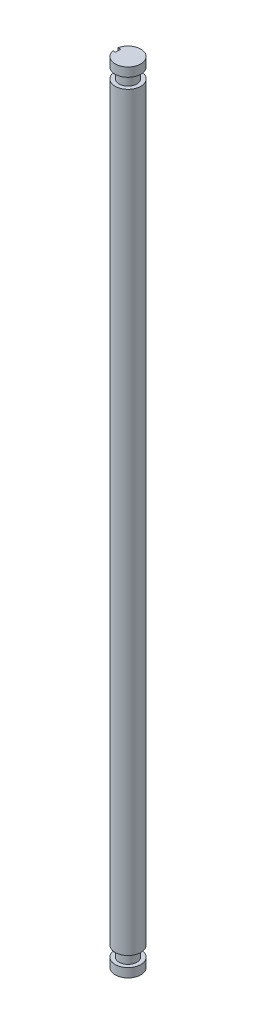
ISO-10303-21;
HEADER;
FILE_DESCRIPTION(('STEP AP214'),'2;1');
FILE_NAME('part.step','',(''),(''),'','','');
FILE_SCHEMA(('AUTOMOTIVE_DESIGN { 1 0 10303 214 1 1 1 1 }'));
ENDSEC;
DATA;
#1=APPLICATION_CONTEXT('core data for automotive mechanical design processes');
#2=APPLICATION_PROTOCOL_DEFINITION('international standard','automotive_design',2000,#1);
#3=PRODUCT_CONTEXT('',#1,'mechanical');
#4=PRODUCT('Part','Part','',(#3));
#5=PRODUCT_RELATED_PRODUCT_CATEGORY('part','',(#4));
#6=PRODUCT_DEFINITION_FORMATION('','',#4);
#7=PRODUCT_DEFINITION_CONTEXT('part definition',#1,'design');
#8=PRODUCT_DEFINITION('design','',#6,#7);
#9=PRODUCT_DEFINITION_SHAPE('','',#8);
#10=(LENGTH_UNIT() NAMED_UNIT(*) SI_UNIT(.MILLI.,.METRE.));
#11=(NAMED_UNIT(*) PLANE_ANGLE_UNIT() SI_UNIT($,.RADIAN.));
#12=(NAMED_UNIT(*) SI_UNIT($,.STERADIAN.) SOLID_ANGLE_UNIT());
#13=UNCERTAINTY_MEASURE_WITH_UNIT(LENGTH_MEASURE(1.E-05),#10,'distance_accuracy_value','');
#14=(GEOMETRIC_REPRESENTATION_CONTEXT(3) GLOBAL_UNCERTAINTY_ASSIGNED_CONTEXT((#13)) GLOBAL_UNIT_ASSIGNED_CONTEXT((#10,
#11,#12)) REPRESENTATION_CONTEXT('',''));
#15=CARTESIAN_POINT('',(0.,0.,0.));
#16=DIRECTION('',(0.,0.,1.));
#17=DIRECTION('',(1.,0.,0.));
#18=AXIS2_PLACEMENT_3D('',#15,#16,#17);
#19=CARTESIAN_POINT('',(0.,-976.376,0.));
#20=DIRECTION('',(0.,1.,0.));
#21=DIRECTION('',(0.,0.,1.));
#22=AXIS2_PLACEMENT_3D('',#19,#20,#21);
#23=PLANE('',#22);
#24=DIRECTION('',(1.,0.,0.));
#25=VECTOR('',#24,1.);
#26=CARTESIAN_POINT('',(0.,-976.376,-6.35));
#27=LINE('',#26,#25);
#28=CARTESIAN_POINT('',(-31.0890766653257,-976.376,-6.35));
#29=VERTEX_POINT('',#28);
#30=CARTESIAN_POINT('',(-24.60625,-976.376,-6.35));
#31=VERTEX_POINT('',#30);
#32=EDGE_CURVE('E193',#29,#31,#27,.T.);
#33=ORIENTED_EDGE('',*,*,#32,.F.);
#34=CARTESIAN_POINT('',(0.,-976.376,0.));
#35=DIRECTION('',(0.,-1.,0.));
#36=DIRECTION('',(0.,0.,-1.));
#37=AXIS2_PLACEMENT_3D('',#34,#35,#36);
#38=CIRCLE('',#37,31.73095);
#39=CARTESIAN_POINT('',(-31.0890766653257,-976.376,6.35));
#40=VERTEX_POINT('',#39);
#41=EDGE_CURVE('E141',#29,#40,#38,.T.);
#42=ORIENTED_EDGE('',*,*,#41,.T.);
#43=DIRECTION('',(-1.,0.,0.));
#44=VECTOR('',#43,1.);
#45=CARTESIAN_POINT('',(0.,-976.376,6.35));
#46=LINE('',#45,#44);
#47=CARTESIAN_POINT('',(-24.60625,-976.376,6.35));
#48=VERTEX_POINT('',#47);
#49=EDGE_CURVE('E209',#48,#40,#46,.T.);
#50=ORIENTED_EDGE('',*,*,#49,.F.);
#51=DIRECTION('',(0.,0.,1.));
#52=VECTOR('',#51,1.);
#53=CARTESIAN_POINT('',(-24.60625,-976.376,0.));
#54=LINE('',#53,#52);
#55=EDGE_CURVE('E184',#31,#48,#54,.T.);
#56=ORIENTED_EDGE('',*,*,#55,.F.);
#57=EDGE_LOOP('',(#33,#42,#50,#56));
#58=FACE_BOUND('',#57,.T.);
#59=ADVANCED_FACE('F43',(#58),#23,.F.);
#60=CARTESIAN_POINT('',(0.,-1001.776,0.));
#61=DIRECTION('',(0.,-1.,0.));
#62=DIRECTION('',(0.,0.,-1.));
#63=AXIS2_PLACEMENT_3D('',#60,#61,#62);
#64=CYLINDRICAL_SURFACE('',#63,31.73095);
#65=DIRECTION('',(0.,-1.,0.));
#66=VECTOR('',#65,1.);
#67=CARTESIAN_POINT('',(-31.0890766653257,-1001.776,-6.35));
#68=LINE('',#67,#66);
#69=CARTESIAN_POINT('',(-31.0890766653257,-954.024,-6.35));
#70=VERTEX_POINT('',#69);
#71=EDGE_CURVE('E195',#70,#29,#68,.T.);
#72=ORIENTED_EDGE('',*,*,#71,.F.);
#73=CARTESIAN_POINT('',(0.,-954.024,0.));
#74=DIRECTION('',(0.,-1.,0.));
#75=DIRECTION('',(0.,0.,-1.));
#76=AXIS2_PLACEMENT_3D('',#73,#74,#75);
#77=CIRCLE('',#76,31.73095);
#78=CARTESIAN_POINT('',(-31.0890766653257,-954.024,6.35));
#79=VERTEX_POINT('',#78);
#80=EDGE_CURVE('E158',#70,#79,#77,.T.);
#81=ORIENTED_EDGE('',*,*,#80,.T.);
#82=DIRECTION('',(0.,-1.,0.));
#83=VECTOR('',#82,1.);
#84=CARTESIAN_POINT('',(-31.0890766653257,-1001.776,6.35));
#85=LINE('',#84,#83);
#86=EDGE_CURVE('E57',#40,#79,#85,.F.);
#87=ORIENTED_EDGE('',*,*,#86,.F.);
#88=ORIENTED_EDGE('',*,*,#41,.F.);
#89=EDGE_LOOP('',(#72,#81,#87,#88));
#90=FACE_BOUND('',#89,.T.);
#91=ADVANCED_FACE('F276',(#90),#64,.T.);
#92=CARTESIAN_POINT('',(-31.73095,-954.024,0.));
#93=DIRECTION('',(0.,-1.,0.));
#94=DIRECTION('',(0.,0.,-1.));
#95=AXIS2_PLACEMENT_3D('',#92,#93,#94);
#96=PLANE('',#95);
#97=CARTESIAN_POINT('',(0.,-954.024,0.));
#98=DIRECTION('',(0.,-1.,0.));
#99=DIRECTION('',(0.,0.,-1.));
#100=AXIS2_PLACEMENT_3D('',#97,#98,#99);
#101=CIRCLE('',#100,22.0218);
#102=CARTESIAN_POINT('',(0.,-954.024,-22.0218));
#103=VERTEX_POINT('',#102);
#104=EDGE_CURVE('E161',#103,#103,#101,.T.);
#105=ORIENTED_EDGE('',*,*,#104,.T.);
#106=EDGE_LOOP('',(#105));
#107=FACE_BOUND('',#106,.T.);
#108=DIRECTION('',(-1.,0.,0.));
#109=VECTOR('',#108,1.);
#110=CARTESIAN_POINT('',(-31.73095,-954.024,-6.35));
#111=LINE('',#110,#109);
#112=CARTESIAN_POINT('',(-24.60625,-954.024,-6.35));
#113=VERTEX_POINT('',#112);
#114=EDGE_CURVE('E197',#113,#70,#111,.T.);
#115=ORIENTED_EDGE('',*,*,#114,.F.);
#116=DIRECTION('',(0.,0.,-1.));
#117=VECTOR('',#116,1.);
#118=CARTESIAN_POINT('',(-24.60625,-954.024,0.));
#119=LINE('',#118,#117);
#120=CARTESIAN_POINT('',(-24.60625,-954.024,6.35));
#121=VERTEX_POINT('',#120);
#122=EDGE_CURVE('E186',#121,#113,#119,.T.);
#123=ORIENTED_EDGE('',*,*,#122,.F.);
#124=DIRECTION('',(1.,0.,0.));
#125=VECTOR('',#124,1.);
#126=CARTESIAN_POINT('',(-31.73095,-954.024,6.35));
#127=LINE('',#126,#125);
#128=EDGE_CURVE('E212',#79,#121,#127,.T.);
#129=ORIENTED_EDGE('',*,*,#128,.F.);
#130=ORIENTED_EDGE('',*,*,#80,.F.);
#131=EDGE_LOOP('',(#115,#123,#129,#130));
#132=FACE_BOUND('',#131,.T.);
#133=ADVANCED_FACE('F282',(#107,#132),#96,.F.);
#134=CARTESIAN_POINT('',(-22.0218,-928.2176,0.));
#135=DIRECTION('',(0.,1.,0.));
#136=DIRECTION('',(0.,0.,1.));
#137=AXIS2_PLACEMENT_3D('',#134,#135,#136);
#138=PLANE('',#137);
#139=CARTESIAN_POINT('',(0.,-928.2176,0.));
#140=DIRECTION('',(0.,-1.,0.));
#141=DIRECTION('',(0.,0.,-1.));
#142=AXIS2_PLACEMENT_3D('',#139,#140,#141);
#143=CIRCLE('',#142,22.0218);
#144=CARTESIAN_POINT('',(0.,-928.2176,-22.0218));
#145=VERTEX_POINT('',#144);
#146=EDGE_CURVE('E164',#145,#145,#143,.T.);
#147=ORIENTED_EDGE('',*,*,#146,.F.);
#148=EDGE_LOOP('',(#147));
#149=FACE_BOUND('',#148,.T.);
#150=DIRECTION('',(1.,0.,0.));
#151=VECTOR('',#150,1.);
#152=CARTESIAN_POINT('',(-22.0218,-928.2176,-6.35));
#153=LINE('',#152,#151);
#154=CARTESIAN_POINT('',(-31.0890766653257,-928.2176,-6.35));
#155=VERTEX_POINT('',#154);
#156=CARTESIAN_POINT('',(-24.60625,-928.2176,-6.35));
#157=VERTEX_POINT('',#156);
#158=EDGE_CURVE('E199',#155,#157,#153,.T.);
#159=ORIENTED_EDGE('',*,*,#158,.F.);
#160=CARTESIAN_POINT('',(0.,-928.2176,0.));
#161=DIRECTION('',(0.,-1.,0.));
#162=DIRECTION('',(0.,0.,-1.));
#163=AXIS2_PLACEMENT_3D('',#160,#161,#162);
#164=CIRCLE('',#163,31.73095);
#165=CARTESIAN_POINT('',(-31.0890766653257,-928.2176,6.35));
#166=VERTEX_POINT('',#165);
#167=EDGE_CURVE('E167',#155,#166,#164,.T.);
#168=ORIENTED_EDGE('',*,*,#167,.T.);
#169=DIRECTION('',(-1.,0.,0.));
#170=VECTOR('',#169,1.);
#171=CARTESIAN_POINT('',(-22.0218,-928.2176,6.35));
#172=LINE('',#171,#170);
#173=CARTESIAN_POINT('',(-24.60625,-928.2176,6.35));
#174=VERTEX_POINT('',#173);
#175=EDGE_CURVE('E214',#174,#166,#172,.T.);
#176=ORIENTED_EDGE('',*,*,#175,.F.);
#177=DIRECTION('',(0.,0.,1.));
#178=VECTOR('',#177,1.);
#179=CARTESIAN_POINT('',(-24.60625,-928.2176,0.));
#180=LINE('',#179,#178);
#181=EDGE_CURVE('E188',#157,#174,#180,.T.);
#182=ORIENTED_EDGE('',*,*,#181,.F.);
#183=EDGE_LOOP('',(#159,#168,#176,#182));
#184=FACE_BOUND('',#183,.T.);
#185=ADVANCED_FACE('F237',(#149,#184),#138,.F.);
#186=CARTESIAN_POINT('',(0.,-1001.776,0.));
#187=DIRECTION('',(0.,-1.,0.));
#188=DIRECTION('',(0.,0.,-1.));
#189=AXIS2_PLACEMENT_3D('',#186,#187,#188);
#190=CYLINDRICAL_SURFACE('',#189,31.73095);
#191=DIRECTION('',(0.,-1.,0.));
#192=VECTOR('',#191,1.);
#193=CARTESIAN_POINT('',(-31.0890766653257,-1001.776,-6.35));
#194=LINE('',#193,#192);
#195=CARTESIAN_POINT('',(-31.0890766653257,928.3446,-6.35));
#196=VERTEX_POINT('',#195);
#197=EDGE_CURVE('E201',#196,#155,#194,.T.);
#198=ORIENTED_EDGE('',*,*,#197,.F.);
#199=CARTESIAN_POINT('',(0.,928.3446,0.));
#200=DIRECTION('',(0.,-1.,0.));
#201=DIRECTION('',(0.,0.,-1.));
#202=AXIS2_PLACEMENT_3D('',#199,#200,#201);
#203=CIRCLE('',#202,31.73095);
#204=CARTESIAN_POINT('',(-31.0890766653257,928.3446,6.35));
#205=VERTEX_POINT('',#204);
#206=EDGE_CURVE('E170',#196,#205,#203,.T.);
#207=ORIENTED_EDGE('',*,*,#206,.T.);
#208=DIRECTION('',(0.,-1.,0.));
#209=VECTOR('',#208,1.);
#210=CARTESIAN_POINT('',(-31.0890766653257,-1001.776,6.35));
#211=LINE('',#210,#209);
#212=EDGE_CURVE('E65',#166,#205,#211,.F.);
#213=ORIENTED_EDGE('',*,*,#212,.F.);
#214=ORIENTED_EDGE('',*,*,#167,.F.);
#215=EDGE_LOOP('',(#198,#207,#213,#214));
#216=FACE_BOUND('',#215,.T.);
#217=ADVANCED_FACE('F241',(#216),#190,.T.);
#218=CARTESIAN_POINT('',(-31.73095,928.3446,0.));
#219=DIRECTION('',(0.,-1.,0.));
#220=DIRECTION('',(0.,0.,-1.));
#221=AXIS2_PLACEMENT_3D('',#218,#219,#220);
#222=PLANE('',#221);
#223=CARTESIAN_POINT('',(0.,928.3446,0.));
#224=DIRECTION('',(0.,-1.,0.));
#225=DIRECTION('',(0.,0.,-1.));
#226=AXIS2_PLACEMENT_3D('',#223,#224,#225);
#227=CIRCLE('',#226,22.0218);
#228=CARTESIAN_POINT('',(0.,928.3446,-22.0218));
#229=VERTEX_POINT('',#228);
#230=EDGE_CURVE('E173',#229,#229,#227,.T.);
#231=ORIENTED_EDGE('',*,*,#230,.T.);
#232=EDGE_LOOP('',(#231));
#233=FACE_BOUND('',#232,.T.);
#234=DIRECTION('',(-1.,0.,0.));
#235=VECTOR('',#234,1.);
#236=CARTESIAN_POINT('',(-31.73095,928.3446,-6.35));
#237=LINE('',#236,#235);
#238=CARTESIAN_POINT('',(-24.60625,928.3446,-6.35));
#239=VERTEX_POINT('',#238);
#240=EDGE_CURVE('E203',#239,#196,#237,.T.);
#241=ORIENTED_EDGE('',*,*,#240,.F.);
#242=DIRECTION('',(0.,0.,-1.));
#243=VECTOR('',#242,1.);
#244=CARTESIAN_POINT('',(-24.60625,928.3446,0.));
#245=LINE('',#244,#243);
#246=CARTESIAN_POINT('',(-24.60625,928.3446,6.35));
#247=VERTEX_POINT('',#246);
#248=EDGE_CURVE('E190',#247,#239,#245,.T.);
#249=ORIENTED_EDGE('',*,*,#248,.F.);
#250=DIRECTION('',(1.,0.,0.));
#251=VECTOR('',#250,1.);
#252=CARTESIAN_POINT('',(-31.73095,928.3446,6.35));
#253=LINE('',#252,#251);
#254=EDGE_CURVE('E217',#205,#247,#253,.T.);
#255=ORIENTED_EDGE('',*,*,#254,.F.);
#256=ORIENTED_EDGE('',*,*,#206,.F.);
#257=EDGE_LOOP('',(#241,#249,#255,#256));
#258=FACE_BOUND('',#257,.T.);
#259=ADVANCED_FACE('F245',(#233,#258),#222,.F.);
#260=CARTESIAN_POINT('',(-22.0218,954.151,0.));
#261=DIRECTION('',(0.,1.,0.));
#262=DIRECTION('',(0.,0.,1.));
#263=AXIS2_PLACEMENT_3D('',#260,#261,#262);
#264=PLANE('',#263);
#265=CARTESIAN_POINT('',(0.,954.151,0.));
#266=DIRECTION('',(0.,-1.,0.));
#267=DIRECTION('',(0.,0.,-1.));
#268=AXIS2_PLACEMENT_3D('',#265,#266,#267);
#269=CIRCLE('',#268,22.0218);
#270=CARTESIAN_POINT('',(0.,954.151,-22.0218));
#271=VERTEX_POINT('',#270);
#272=EDGE_CURVE('E176',#271,#271,#269,.T.);
#273=ORIENTED_EDGE('',*,*,#272,.F.);
#274=EDGE_LOOP('',(#273));
#275=FACE_BOUND('',#274,.T.);
#276=DIRECTION('',(1.,0.,0.));
#277=VECTOR('',#276,1.);
#278=CARTESIAN_POINT('',(-22.0218,954.151,-6.35));
#279=LINE('',#278,#277);
#280=CARTESIAN_POINT('',(-31.0890766653257,954.151,-6.35));
#281=VERTEX_POINT('',#280);
#282=CARTESIAN_POINT('',(-24.60625,954.151,-6.35));
#283=VERTEX_POINT('',#282);
#284=EDGE_CURVE('E205',#281,#283,#279,.T.);
#285=ORIENTED_EDGE('',*,*,#284,.F.);
#286=CARTESIAN_POINT('',(0.,954.151,0.));
#287=DIRECTION('',(0.,-1.,0.));
#288=DIRECTION('',(0.,0.,-1.));
#289=AXIS2_PLACEMENT_3D('',#286,#287,#288);
#290=CIRCLE('',#289,31.73095);
#291=CARTESIAN_POINT('',(-31.0890766653257,954.151,6.35));
#292=VERTEX_POINT('',#291);
#293=EDGE_CURVE('E179',#281,#292,#290,.T.);
#294=ORIENTED_EDGE('',*,*,#293,.T.);
#295=DIRECTION('',(-1.,0.,0.));
#296=VECTOR('',#295,1.);
#297=CARTESIAN_POINT('',(-22.0218,954.151,6.35));
#298=LINE('',#297,#296);
#299=CARTESIAN_POINT('',(-24.60625,954.151,6.35));
#300=VERTEX_POINT('',#299);
#301=EDGE_CURVE('E219',#300,#292,#298,.T.);
#302=ORIENTED_EDGE('',*,*,#301,.F.);
#303=DIRECTION('',(0.,0.,1.));
#304=VECTOR('',#303,1.);
#305=CARTESIAN_POINT('',(-24.60625,954.151,0.));
#306=LINE('',#305,#304);
#307=EDGE_CURVE('E148',#283,#300,#306,.T.);
#308=ORIENTED_EDGE('',*,*,#307,.F.);
#309=EDGE_LOOP('',(#285,#294,#302,#308));
#310=FACE_BOUND('',#309,.T.);
#311=ADVANCED_FACE('F254',(#275,#310),#264,.F.);
#312=CARTESIAN_POINT('',(0.,-1001.776,0.));
#313=DIRECTION('',(0.,-1.,0.));
#314=DIRECTION('',(0.,0.,-1.));
#315=AXIS2_PLACEMENT_3D('',#312,#313,#314);
#316=CYLINDRICAL_SURFACE('',#315,31.73095);
#317=DIRECTION('',(0.,-1.,0.));
#318=VECTOR('',#317,1.);
#319=CARTESIAN_POINT('',(-31.0890766653257,-1001.776,-6.35));
#320=LINE('',#319,#318);
#321=CARTESIAN_POINT('',(-31.0890766653257,976.376,-6.35));
#322=VERTEX_POINT('',#321);
#323=EDGE_CURVE('E207',#322,#281,#320,.T.);
#324=ORIENTED_EDGE('',*,*,#323,.F.);
#325=CARTESIAN_POINT('',(0.,976.376,0.));
#326=DIRECTION('',(0.,-1.,0.));
#327=DIRECTION('',(0.,0.,-1.));
#328=AXIS2_PLACEMENT_3D('',#325,#326,#327);
#329=CIRCLE('',#328,31.73095);
#330=CARTESIAN_POINT('',(-31.0890766653257,976.376,6.35));
#331=VERTEX_POINT('',#330);
#332=EDGE_CURVE('E182',#322,#331,#329,.T.);
#333=ORIENTED_EDGE('',*,*,#332,.T.);
#334=DIRECTION('',(0.,-1.,0.));
#335=VECTOR('',#334,1.);
#336=CARTESIAN_POINT('',(-31.0890766653257,-1001.776,6.35));
#337=LINE('',#336,#335);
#338=EDGE_CURVE('E136',#292,#331,#337,.F.);
#339=ORIENTED_EDGE('',*,*,#338,.F.);
#340=ORIENTED_EDGE('',*,*,#293,.F.);
#341=EDGE_LOOP('',(#324,#333,#339,#340));
#342=FACE_BOUND('',#341,.T.);
#343=ADVANCED_FACE('F258',(#342),#316,.T.);
#344=CARTESIAN_POINT('',(-31.73095,976.376,0.));
#345=DIRECTION('',(0.,-1.,0.));
#346=DIRECTION('',(0.,0.,-1.));
#347=AXIS2_PLACEMENT_3D('',#344,#345,#346);
#348=PLANE('',#347);
#349=DIRECTION('',(-1.,0.,0.));
#350=VECTOR('',#349,1.);
#351=CARTESIAN_POINT('',(-31.73095,976.376,-6.35));
#352=LINE('',#351,#350);
#353=CARTESIAN_POINT('',(-24.60625,976.376,-6.35));
#354=VERTEX_POINT('',#353);
#355=EDGE_CURVE('E11',#354,#322,#352,.T.);
#356=ORIENTED_EDGE('',*,*,#355,.F.);
#357=DIRECTION('',(0.,0.,-1.));
#358=VECTOR('',#357,1.);
#359=CARTESIAN_POINT('',(-24.60625,976.376,0.));
#360=LINE('',#359,#358);
#361=CARTESIAN_POINT('',(-24.60625,976.376,6.35));
#362=VERTEX_POINT('',#361);
#363=EDGE_CURVE('E50',#362,#354,#360,.T.);
#364=ORIENTED_EDGE('',*,*,#363,.F.);
#365=DIRECTION('',(1.,0.,0.));
#366=VECTOR('',#365,1.);
#367=CARTESIAN_POINT('',(-31.73095,976.376,6.35));
#368=LINE('',#367,#366);
#369=EDGE_CURVE('E130',#331,#362,#368,.T.);
#370=ORIENTED_EDGE('',*,*,#369,.F.);
#371=ORIENTED_EDGE('',*,*,#332,.F.);
#372=EDGE_LOOP('',(#356,#364,#370,#371));
#373=FACE_BOUND('',#372,.T.);
#374=ADVANCED_FACE('F154',(#373),#348,.F.);
#375=CARTESIAN_POINT('',(0.,-1001.776,0.));
#376=DIRECTION('',(0.,-1.,0.));
#377=DIRECTION('',(0.,0.,-1.));
#378=AXIS2_PLACEMENT_3D('',#375,#376,#377);
#379=CYLINDRICAL_SURFACE('',#378,22.0218);
#380=ORIENTED_EDGE('',*,*,#104,.F.);
#381=EDGE_LOOP('',(#380));
#382=FACE_BOUND('',#381,.T.);
#383=ORIENTED_EDGE('',*,*,#146,.T.);
#384=EDGE_LOOP('',(#383));
#385=FACE_BOUND('',#384,.T.);
#386=ADVANCED_FACE('F301',(#382,#385),#379,.T.);
#387=CARTESIAN_POINT('',(0.,-1001.776,0.));
#388=DIRECTION('',(0.,-1.,0.));
#389=DIRECTION('',(0.,0.,-1.));
#390=AXIS2_PLACEMENT_3D('',#387,#388,#389);
#391=CYLINDRICAL_SURFACE('',#390,22.0218);
#392=ORIENTED_EDGE('',*,*,#230,.F.);
#393=EDGE_LOOP('',(#392));
#394=FACE_BOUND('',#393,.T.);
#395=ORIENTED_EDGE('',*,*,#272,.T.);
#396=EDGE_LOOP('',(#395));
#397=FACE_BOUND('',#396,.T.);
#398=ADVANCED_FACE('F269',(#394,#397),#391,.T.);
#399=CARTESIAN_POINT('',(-24.60625,998.728,6.35));
#400=DIRECTION('',(0.,0.,-1.));
#401=DIRECTION('',(-1.,0.,0.));
#402=AXIS2_PLACEMENT_3D('',#399,#400,#401);
#403=PLANE('',#402);
#404=ORIENTED_EDGE('',*,*,#301,.T.);
#405=ORIENTED_EDGE('',*,*,#338,.T.);
#406=ORIENTED_EDGE('',*,*,#369,.T.);
#407=DIRECTION('',(0.,-1.,0.));
#408=VECTOR('',#407,1.);
#409=CARTESIAN_POINT('',(-24.60625,998.728,6.35));
#410=LINE('',#409,#408);
#411=EDGE_CURVE('E133',#362,#300,#410,.T.);
#412=ORIENTED_EDGE('',*,*,#411,.T.);
#413=EDGE_LOOP('',(#404,#405,#406,#412));
#414=FACE_BOUND('',#413,.T.);
#415=ADVANCED_FACE('F132',(#414),#403,.T.);
#416=CARTESIAN_POINT('',(-24.60625,998.728,-6.35));
#417=DIRECTION('',(0.,0.,1.));
#418=DIRECTION('',(1.,0.,0.));
#419=AXIS2_PLACEMENT_3D('',#416,#417,#418);
#420=PLANE('',#419);
#421=ORIENTED_EDGE('',*,*,#284,.T.);
#422=DIRECTION('',(0.,-1.,0.));
#423=VECTOR('',#422,1.);
#424=CARTESIAN_POINT('',(-24.60625,998.728,-6.35));
#425=LINE('',#424,#423);
#426=EDGE_CURVE('E222',#354,#283,#425,.T.);
#427=ORIENTED_EDGE('',*,*,#426,.F.);
#428=ORIENTED_EDGE('',*,*,#355,.T.);
#429=ORIENTED_EDGE('',*,*,#323,.T.);
#430=EDGE_LOOP('',(#421,#427,#428,#429));
#431=FACE_BOUND('',#430,.T.);
#432=ADVANCED_FACE('F259',(#431),#420,.T.);
#433=CARTESIAN_POINT('',(-24.60625,998.728,-6.35));
#434=DIRECTION('',(-1.,0.,0.));
#435=DIRECTION('',(0.,0.,1.));
#436=AXIS2_PLACEMENT_3D('',#433,#434,#435);
#437=PLANE('',#436);
#438=ORIENTED_EDGE('',*,*,#307,.T.);
#439=ORIENTED_EDGE('',*,*,#411,.F.);
#440=ORIENTED_EDGE('',*,*,#363,.T.);
#441=ORIENTED_EDGE('',*,*,#426,.T.);
#442=EDGE_LOOP('',(#438,#439,#440,#441));
#443=FACE_BOUND('',#442,.T.);
#444=ADVANCED_FACE('F144',(#443),#437,.T.);
#445=ORIENTED_EDGE('',*,*,#175,.T.);
#446=ORIENTED_EDGE('',*,*,#212,.T.);
#447=ORIENTED_EDGE('',*,*,#254,.T.);
#448=EDGE_CURVE('E150',#247,#174,#410,.T.);
#449=ORIENTED_EDGE('',*,*,#448,.T.);
#450=EDGE_LOOP('',(#445,#446,#447,#449));
#451=FACE_BOUND('',#450,.T.);
#452=ADVANCED_FACE('F231',(#451),#403,.T.);
#453=ORIENTED_EDGE('',*,*,#158,.T.);
#454=EDGE_CURVE('E224',#239,#157,#425,.T.);
#455=ORIENTED_EDGE('',*,*,#454,.F.);
#456=ORIENTED_EDGE('',*,*,#240,.T.);
#457=ORIENTED_EDGE('',*,*,#197,.T.);
#458=EDGE_LOOP('',(#453,#455,#456,#457));
#459=FACE_BOUND('',#458,.T.);
#460=ADVANCED_FACE('F250',(#459),#420,.T.);
#461=ORIENTED_EDGE('',*,*,#181,.T.);
#462=ORIENTED_EDGE('',*,*,#448,.F.);
#463=ORIENTED_EDGE('',*,*,#248,.T.);
#464=ORIENTED_EDGE('',*,*,#454,.T.);
#465=EDGE_LOOP('',(#461,#462,#463,#464));
#466=FACE_BOUND('',#465,.T.);
#467=ADVANCED_FACE('F248',(#466),#437,.T.);
#468=ORIENTED_EDGE('',*,*,#55,.T.);
#469=EDGE_CURVE('E152',#121,#48,#410,.T.);
#470=ORIENTED_EDGE('',*,*,#469,.F.);
#471=ORIENTED_EDGE('',*,*,#122,.T.);
#472=EDGE_CURVE('E149',#113,#31,#425,.T.);
#473=ORIENTED_EDGE('',*,*,#472,.T.);
#474=EDGE_LOOP('',(#468,#470,#471,#473));
#475=FACE_BOUND('',#474,.T.);
#476=ADVANCED_FACE('F268',(#475),#437,.T.);
#477=ORIENTED_EDGE('',*,*,#32,.T.);
#478=ORIENTED_EDGE('',*,*,#472,.F.);
#479=ORIENTED_EDGE('',*,*,#114,.T.);
#480=ORIENTED_EDGE('',*,*,#71,.T.);
#481=EDGE_LOOP('',(#477,#478,#479,#480));
#482=FACE_BOUND('',#481,.T.);
#483=ADVANCED_FACE('F262',(#482),#420,.T.);
#484=ORIENTED_EDGE('',*,*,#49,.T.);
#485=ORIENTED_EDGE('',*,*,#86,.T.);
#486=ORIENTED_EDGE('',*,*,#128,.T.);
#487=ORIENTED_EDGE('',*,*,#469,.T.);
#488=EDGE_LOOP('',(#484,#485,#486,#487));
#489=FACE_BOUND('',#488,.T.);
#490=ADVANCED_FACE('F271',(#489),#403,.T.);
#491=CLOSED_SHELL('',(#59,#91,#133,#185,#217,#259,#311,#343,#374,#386,#398,#415,#432,#444,#452,
#460,#467,#476,#483,#490));
#492=MANIFOLD_SOLID_BREP('B2',#491);
#493=ADVANCED_BREP_SHAPE_REPRESENTATION('',(#18,#492),#14);
#494=SHAPE_DEFINITION_REPRESENTATION(#9,#493);
ENDSEC;
END-ISO-10303-21;
